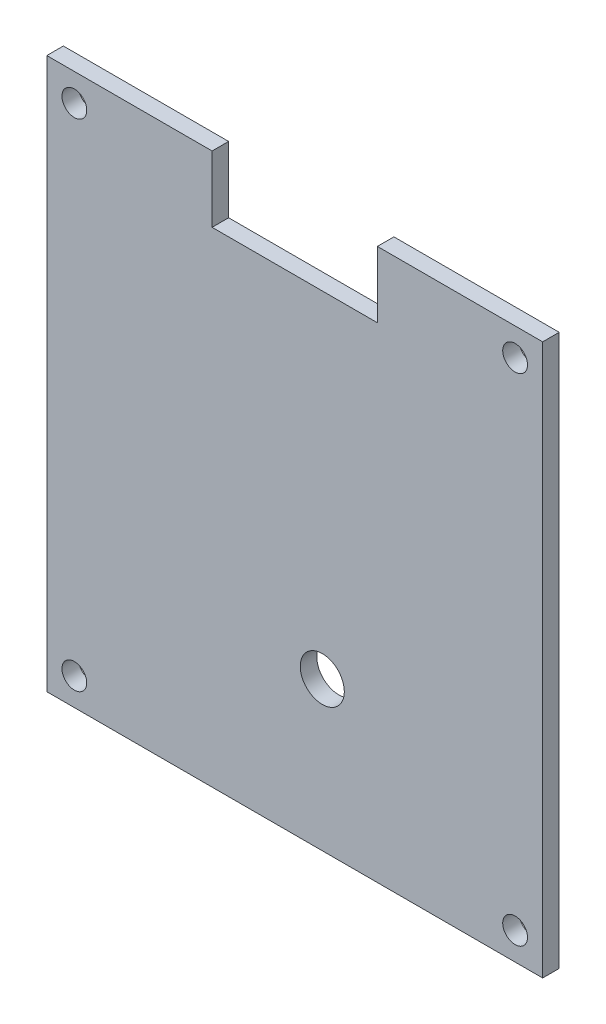
ISO-10303-21;
HEADER;
FILE_DESCRIPTION(('STEP AP214'),'2;1');
FILE_NAME('part.step','',(''),(''),'','','');
FILE_SCHEMA(('AUTOMOTIVE_DESIGN { 1 0 10303 214 1 1 1 1 }'));
ENDSEC;
DATA;
#1=APPLICATION_CONTEXT('core data for automotive mechanical design processes');
#2=APPLICATION_PROTOCOL_DEFINITION('international standard','automotive_design',2000,#1);
#3=PRODUCT_CONTEXT('',#1,'mechanical');
#4=PRODUCT('Part','Part','',(#3));
#5=PRODUCT_RELATED_PRODUCT_CATEGORY('part','',(#4));
#6=PRODUCT_DEFINITION_FORMATION('','',#4);
#7=PRODUCT_DEFINITION_CONTEXT('part definition',#1,'design');
#8=PRODUCT_DEFINITION('design','',#6,#7);
#9=PRODUCT_DEFINITION_SHAPE('','',#8);
#10=(LENGTH_UNIT() NAMED_UNIT(*) SI_UNIT(.MILLI.,.METRE.));
#11=(NAMED_UNIT(*) PLANE_ANGLE_UNIT() SI_UNIT($,.RADIAN.));
#12=(NAMED_UNIT(*) SI_UNIT($,.STERADIAN.) SOLID_ANGLE_UNIT());
#13=UNCERTAINTY_MEASURE_WITH_UNIT(LENGTH_MEASURE(1.E-05),#10,'distance_accuracy_value','');
#14=(GEOMETRIC_REPRESENTATION_CONTEXT(3) GLOBAL_UNCERTAINTY_ASSIGNED_CONTEXT((#13)) GLOBAL_UNIT_ASSIGNED_CONTEXT((#10,
#11,#12)) REPRESENTATION_CONTEXT('',''));
#15=CARTESIAN_POINT('',(0.,0.,0.));
#16=DIRECTION('',(0.,0.,1.));
#17=DIRECTION('',(1.,0.,0.));
#18=AXIS2_PLACEMENT_3D('',#15,#16,#17);
#19=CARTESIAN_POINT('',(-45.,50.,3.));
#20=DIRECTION('',(0.,1.,0.));
#21=DIRECTION('',(0.,0.,1.));
#22=AXIS2_PLACEMENT_3D('',#19,#20,#21);
#23=PLANE('',#22);
#24=DIRECTION('',(1.,0.,0.));
#25=VECTOR('',#24,1.);
#26=CARTESIAN_POINT('',(-45.,50.,0.));
#27=LINE('',#26,#25);
#28=CARTESIAN_POINT('',(-45.,50.,0.));
#29=VERTEX_POINT('',#28);
#30=CARTESIAN_POINT('',(-15.,50.,0.));
#31=VERTEX_POINT('',#30);
#32=EDGE_CURVE('E130',#29,#31,#27,.T.);
#33=ORIENTED_EDGE('',*,*,#32,.F.);
#34=DIRECTION('',(0.,0.,-1.));
#35=VECTOR('',#34,1.);
#36=CARTESIAN_POINT('',(-45.,50.,3.));
#37=LINE('',#36,#35);
#38=CARTESIAN_POINT('',(-45.,50.,3.));
#39=VERTEX_POINT('',#38);
#40=EDGE_CURVE('E11',#39,#29,#37,.T.);
#41=ORIENTED_EDGE('',*,*,#40,.F.);
#42=DIRECTION('',(1.,0.,0.));
#43=VECTOR('',#42,1.);
#44=CARTESIAN_POINT('',(-45.,50.,3.));
#45=LINE('',#44,#43);
#46=CARTESIAN_POINT('',(-15.,50.,3.));
#47=VERTEX_POINT('',#46);
#48=EDGE_CURVE('E151',#39,#47,#45,.T.);
#49=ORIENTED_EDGE('',*,*,#48,.T.);
#50=DIRECTION('',(0.,0.,-1.));
#51=VECTOR('',#50,1.);
#52=CARTESIAN_POINT('',(-15.,50.,3.));
#53=LINE('',#52,#51);
#54=EDGE_CURVE('E36',#47,#31,#53,.T.);
#55=ORIENTED_EDGE('',*,*,#54,.T.);
#56=EDGE_LOOP('',(#33,#41,#49,#55));
#57=FACE_BOUND('',#56,.T.);
#58=ADVANCED_FACE('F33',(#57),#23,.T.);
#59=CARTESIAN_POINT('',(-45.,-50.,3.));
#60=DIRECTION('',(-1.,0.,0.));
#61=DIRECTION('',(0.,0.,1.));
#62=AXIS2_PLACEMENT_3D('',#59,#60,#61);
#63=PLANE('',#62);
#64=DIRECTION('',(0.,1.,0.));
#65=VECTOR('',#64,1.);
#66=CARTESIAN_POINT('',(-45.,-50.,0.));
#67=LINE('',#66,#65);
#68=CARTESIAN_POINT('',(-45.,-50.,0.));
#69=VERTEX_POINT('',#68);
#70=EDGE_CURVE('E149',#69,#29,#67,.T.);
#71=ORIENTED_EDGE('',*,*,#70,.F.);
#72=DIRECTION('',(0.,0.,-1.));
#73=VECTOR('',#72,1.);
#74=CARTESIAN_POINT('',(-45.,-50.,3.));
#75=LINE('',#74,#73);
#76=CARTESIAN_POINT('',(-45.,-50.,3.));
#77=VERTEX_POINT('',#76);
#78=EDGE_CURVE('E42',#77,#69,#75,.T.);
#79=ORIENTED_EDGE('',*,*,#78,.F.);
#80=DIRECTION('',(0.,1.,0.));
#81=VECTOR('',#80,1.);
#82=CARTESIAN_POINT('',(-45.,-50.,3.));
#83=LINE('',#82,#81);
#84=EDGE_CURVE('E120',#77,#39,#83,.T.);
#85=ORIENTED_EDGE('',*,*,#84,.T.);
#86=ORIENTED_EDGE('',*,*,#40,.T.);
#87=EDGE_LOOP('',(#71,#79,#85,#86));
#88=FACE_BOUND('',#87,.T.);
#89=ADVANCED_FACE('F163',(#88),#63,.T.);
#90=CARTESIAN_POINT('',(45.,-50.,3.));
#91=DIRECTION('',(0.,-1.,0.));
#92=DIRECTION('',(0.,0.,-1.));
#93=AXIS2_PLACEMENT_3D('',#90,#91,#92);
#94=PLANE('',#93);
#95=DIRECTION('',(-1.,0.,0.));
#96=VECTOR('',#95,1.);
#97=CARTESIAN_POINT('',(45.,-50.,0.));
#98=LINE('',#97,#96);
#99=CARTESIAN_POINT('',(45.,-50.,0.));
#100=VERTEX_POINT('',#99);
#101=EDGE_CURVE('E107',#100,#69,#98,.T.);
#102=ORIENTED_EDGE('',*,*,#101,.F.);
#103=DIRECTION('',(0.,0.,-1.));
#104=VECTOR('',#103,1.);
#105=CARTESIAN_POINT('',(45.,-50.,3.));
#106=LINE('',#105,#104);
#107=CARTESIAN_POINT('',(45.,-50.,3.));
#108=VERTEX_POINT('',#107);
#109=EDGE_CURVE('E102',#108,#100,#106,.T.);
#110=ORIENTED_EDGE('',*,*,#109,.F.);
#111=DIRECTION('',(-1.,0.,0.));
#112=VECTOR('',#111,1.);
#113=CARTESIAN_POINT('',(45.,-50.,3.));
#114=LINE('',#113,#112);
#115=EDGE_CURVE('E105',#108,#77,#114,.T.);
#116=ORIENTED_EDGE('',*,*,#115,.T.);
#117=ORIENTED_EDGE('',*,*,#78,.T.);
#118=EDGE_LOOP('',(#102,#110,#116,#117));
#119=FACE_BOUND('',#118,.T.);
#120=ADVANCED_FACE('F104',(#119),#94,.T.);
#121=CARTESIAN_POINT('',(45.,50.,3.));
#122=DIRECTION('',(1.,0.,0.));
#123=DIRECTION('',(0.,0.,-1.));
#124=AXIS2_PLACEMENT_3D('',#121,#122,#123);
#125=PLANE('',#124);
#126=DIRECTION('',(0.,-1.,0.));
#127=VECTOR('',#126,1.);
#128=CARTESIAN_POINT('',(45.,50.,0.));
#129=LINE('',#128,#127);
#130=CARTESIAN_POINT('',(45.,50.,0.));
#131=VERTEX_POINT('',#130);
#132=EDGE_CURVE('E146',#131,#100,#129,.T.);
#133=ORIENTED_EDGE('',*,*,#132,.F.);
#134=DIRECTION('',(0.,0.,-1.));
#135=VECTOR('',#134,1.);
#136=CARTESIAN_POINT('',(45.,50.,3.));
#137=LINE('',#136,#135);
#138=CARTESIAN_POINT('',(45.,50.,3.));
#139=VERTEX_POINT('',#138);
#140=EDGE_CURVE('E112',#139,#131,#137,.T.);
#141=ORIENTED_EDGE('',*,*,#140,.F.);
#142=DIRECTION('',(0.,-1.,0.));
#143=VECTOR('',#142,1.);
#144=CARTESIAN_POINT('',(45.,50.,3.));
#145=LINE('',#144,#143);
#146=EDGE_CURVE('E118',#139,#108,#145,.T.);
#147=ORIENTED_EDGE('',*,*,#146,.T.);
#148=ORIENTED_EDGE('',*,*,#109,.T.);
#149=EDGE_LOOP('',(#133,#141,#147,#148));
#150=FACE_BOUND('',#149,.T.);
#151=ADVANCED_FACE('F122',(#150),#125,.T.);
#152=CARTESIAN_POINT('',(15.,50.,3.));
#153=DIRECTION('',(0.,1.,0.));
#154=DIRECTION('',(0.,0.,1.));
#155=AXIS2_PLACEMENT_3D('',#152,#153,#154);
#156=PLANE('',#155);
#157=DIRECTION('',(1.,0.,0.));
#158=VECTOR('',#157,1.);
#159=CARTESIAN_POINT('',(15.,50.,0.));
#160=LINE('',#159,#158);
#161=CARTESIAN_POINT('',(15.,50.,0.));
#162=VERTEX_POINT('',#161);
#163=EDGE_CURVE('E143',#162,#131,#160,.T.);
#164=ORIENTED_EDGE('',*,*,#163,.F.);
#165=DIRECTION('',(0.,0.,-1.));
#166=VECTOR('',#165,1.);
#167=CARTESIAN_POINT('',(15.,50.,3.));
#168=LINE('',#167,#166);
#169=CARTESIAN_POINT('',(15.,50.,3.));
#170=VERTEX_POINT('',#169);
#171=EDGE_CURVE('E155',#170,#162,#168,.T.);
#172=ORIENTED_EDGE('',*,*,#171,.F.);
#173=DIRECTION('',(1.,0.,0.));
#174=VECTOR('',#173,1.);
#175=CARTESIAN_POINT('',(15.,50.,3.));
#176=LINE('',#175,#174);
#177=EDGE_CURVE('E123',#170,#139,#176,.T.);
#178=ORIENTED_EDGE('',*,*,#177,.T.);
#179=ORIENTED_EDGE('',*,*,#140,.T.);
#180=EDGE_LOOP('',(#164,#172,#178,#179));
#181=FACE_BOUND('',#180,.T.);
#182=ADVANCED_FACE('F176',(#181),#156,.T.);
#183=CARTESIAN_POINT('',(15.,38.,3.));
#184=DIRECTION('',(-1.,0.,0.));
#185=DIRECTION('',(0.,-1.,0.));
#186=AXIS2_PLACEMENT_3D('',#183,#184,#185);
#187=PLANE('',#186);
#188=DIRECTION('',(0.,1.,0.));
#189=VECTOR('',#188,1.);
#190=CARTESIAN_POINT('',(15.,38.,0.));
#191=LINE('',#190,#189);
#192=CARTESIAN_POINT('',(15.,38.,0.));
#193=VERTEX_POINT('',#192);
#194=EDGE_CURVE('E140',#193,#162,#191,.T.);
#195=ORIENTED_EDGE('',*,*,#194,.F.);
#196=DIRECTION('',(0.,0.,-1.));
#197=VECTOR('',#196,1.);
#198=CARTESIAN_POINT('',(15.,38.,3.));
#199=LINE('',#198,#197);
#200=CARTESIAN_POINT('',(15.,38.,3.));
#201=VERTEX_POINT('',#200);
#202=EDGE_CURVE('E157',#201,#193,#199,.T.);
#203=ORIENTED_EDGE('',*,*,#202,.F.);
#204=DIRECTION('',(0.,1.,0.));
#205=VECTOR('',#204,1.);
#206=CARTESIAN_POINT('',(15.,38.,3.));
#207=LINE('',#206,#205);
#208=EDGE_CURVE('E125',#201,#170,#207,.T.);
#209=ORIENTED_EDGE('',*,*,#208,.T.);
#210=ORIENTED_EDGE('',*,*,#171,.T.);
#211=EDGE_LOOP('',(#195,#203,#209,#210));
#212=FACE_BOUND('',#211,.T.);
#213=ADVANCED_FACE('F179',(#212),#187,.T.);
#214=CARTESIAN_POINT('',(-15.,38.,3.));
#215=DIRECTION('',(0.,1.,0.));
#216=DIRECTION('',(0.,0.,1.));
#217=AXIS2_PLACEMENT_3D('',#214,#215,#216);
#218=PLANE('',#217);
#219=DIRECTION('',(1.,0.,0.));
#220=VECTOR('',#219,1.);
#221=CARTESIAN_POINT('',(-15.,38.,0.));
#222=LINE('',#221,#220);
#223=CARTESIAN_POINT('',(-15.,38.,0.));
#224=VERTEX_POINT('',#223);
#225=EDGE_CURVE('E137',#224,#193,#222,.T.);
#226=ORIENTED_EDGE('',*,*,#225,.F.);
#227=DIRECTION('',(0.,0.,-1.));
#228=VECTOR('',#227,1.);
#229=CARTESIAN_POINT('',(-15.,38.,3.));
#230=LINE('',#229,#228);
#231=CARTESIAN_POINT('',(-15.,38.,3.));
#232=VERTEX_POINT('',#231);
#233=EDGE_CURVE('E158',#232,#224,#230,.T.);
#234=ORIENTED_EDGE('',*,*,#233,.F.);
#235=DIRECTION('',(1.,0.,0.));
#236=VECTOR('',#235,1.);
#237=CARTESIAN_POINT('',(-15.,38.,3.));
#238=LINE('',#237,#236);
#239=EDGE_CURVE('E255',#232,#201,#238,.T.);
#240=ORIENTED_EDGE('',*,*,#239,.T.);
#241=ORIENTED_EDGE('',*,*,#202,.T.);
#242=EDGE_LOOP('',(#226,#234,#240,#241));
#243=FACE_BOUND('',#242,.T.);
#244=ADVANCED_FACE('F183',(#243),#218,.T.);
#245=CARTESIAN_POINT('',(-15.,50.,3.));
#246=DIRECTION('',(1.,0.,0.));
#247=DIRECTION('',(0.,1.,0.));
#248=AXIS2_PLACEMENT_3D('',#245,#246,#247);
#249=PLANE('',#248);
#250=DIRECTION('',(0.,-1.,0.));
#251=VECTOR('',#250,1.);
#252=CARTESIAN_POINT('',(-15.,50.,0.));
#253=LINE('',#252,#251);
#254=EDGE_CURVE('E133',#31,#224,#253,.T.);
#255=ORIENTED_EDGE('',*,*,#254,.F.);
#256=ORIENTED_EDGE('',*,*,#54,.F.);
#257=DIRECTION('',(0.,-1.,0.));
#258=VECTOR('',#257,1.);
#259=CARTESIAN_POINT('',(-15.,50.,3.));
#260=LINE('',#259,#258);
#261=EDGE_CURVE('E253',#47,#232,#260,.T.);
#262=ORIENTED_EDGE('',*,*,#261,.T.);
#263=ORIENTED_EDGE('',*,*,#233,.T.);
#264=EDGE_LOOP('',(#255,#256,#262,#263));
#265=FACE_BOUND('',#264,.T.);
#266=ADVANCED_FACE('F160',(#265),#249,.T.);
#267=CARTESIAN_POINT('',(0.,0.,3.));
#268=DIRECTION('',(0.,0.,-1.));
#269=DIRECTION('',(-1.,0.,0.));
#270=AXIS2_PLACEMENT_3D('',#267,#268,#269);
#271=PLANE('',#270);
#272=CARTESIAN_POINT('',(-40.,-45.,3.));
#273=DIRECTION('',(0.,0.,-1.));
#274=DIRECTION('',(1.,0.,0.));
#275=AXIS2_PLACEMENT_3D('',#272,#273,#274);
#276=CIRCLE('',#275,2.25);
#277=CARTESIAN_POINT('',(-37.75,-45.,3.));
#278=VERTEX_POINT('',#277);
#279=EDGE_CURVE('E222',#278,#278,#276,.T.);
#280=ORIENTED_EDGE('',*,*,#279,.T.);
#281=EDGE_LOOP('',(#280));
#282=FACE_BOUND('',#281,.T.);
#283=CARTESIAN_POINT('',(40.,-45.,3.));
#284=DIRECTION('',(0.,0.,-1.));
#285=DIRECTION('',(1.,0.,0.));
#286=AXIS2_PLACEMENT_3D('',#283,#284,#285);
#287=CIRCLE('',#286,2.25);
#288=CARTESIAN_POINT('',(42.25,-45.,3.));
#289=VERTEX_POINT('',#288);
#290=EDGE_CURVE('E230',#289,#289,#287,.T.);
#291=ORIENTED_EDGE('',*,*,#290,.T.);
#292=EDGE_LOOP('',(#291));
#293=FACE_BOUND('',#292,.T.);
#294=CARTESIAN_POINT('',(40.,45.,3.));
#295=DIRECTION('',(0.,0.,-1.));
#296=DIRECTION('',(1.,0.,0.));
#297=AXIS2_PLACEMENT_3D('',#294,#295,#296);
#298=CIRCLE('',#297,2.25);
#299=CARTESIAN_POINT('',(42.25,45.,3.));
#300=VERTEX_POINT('',#299);
#301=EDGE_CURVE('E236',#300,#300,#298,.T.);
#302=ORIENTED_EDGE('',*,*,#301,.T.);
#303=EDGE_LOOP('',(#302));
#304=FACE_BOUND('',#303,.T.);
#305=CARTESIAN_POINT('',(-40.,45.,3.));
#306=DIRECTION('',(0.,0.,-1.));
#307=DIRECTION('',(1.,0.,0.));
#308=AXIS2_PLACEMENT_3D('',#305,#306,#307);
#309=CIRCLE('',#308,2.25);
#310=CARTESIAN_POINT('',(-37.75,45.,3.));
#311=VERTEX_POINT('',#310);
#312=EDGE_CURVE('E242',#311,#311,#309,.T.);
#313=ORIENTED_EDGE('',*,*,#312,.T.);
#314=EDGE_LOOP('',(#313));
#315=FACE_BOUND('',#314,.T.);
#316=CARTESIAN_POINT('',(5.,-23.,3.));
#317=DIRECTION('',(0.,0.,-1.));
#318=DIRECTION('',(1.,0.,0.));
#319=AXIS2_PLACEMENT_3D('',#316,#317,#318);
#320=CIRCLE('',#319,4.);
#321=CARTESIAN_POINT('',(9.00000000000001,-23.,3.));
#322=VERTEX_POINT('',#321);
#323=EDGE_CURVE('E134',#322,#322,#320,.T.);
#324=ORIENTED_EDGE('',*,*,#323,.T.);
#325=EDGE_LOOP('',(#324));
#326=FACE_BOUND('',#325,.T.);
#327=ORIENTED_EDGE('',*,*,#48,.F.);
#328=ORIENTED_EDGE('',*,*,#84,.F.);
#329=ORIENTED_EDGE('',*,*,#115,.F.);
#330=ORIENTED_EDGE('',*,*,#146,.F.);
#331=ORIENTED_EDGE('',*,*,#177,.F.);
#332=ORIENTED_EDGE('',*,*,#208,.F.);
#333=ORIENTED_EDGE('',*,*,#239,.F.);
#334=ORIENTED_EDGE('',*,*,#261,.F.);
#335=EDGE_LOOP('',(#327,#328,#329,#330,#331,#332,#333,#334));
#336=FACE_BOUND('',#335,.T.);
#337=ADVANCED_FACE('F116',(#282,#293,#304,#315,#326,#336),#271,.F.);
#338=CARTESIAN_POINT('',(0.,0.,0.));
#339=DIRECTION('',(0.,0.,-1.));
#340=DIRECTION('',(-1.,0.,0.));
#341=AXIS2_PLACEMENT_3D('',#338,#339,#340);
#342=PLANE('',#341);
#343=CARTESIAN_POINT('',(-40.,-45.,0.));
#344=DIRECTION('',(0.,0.,-1.));
#345=DIRECTION('',(1.,0.,0.));
#346=AXIS2_PLACEMENT_3D('',#343,#344,#345);
#347=CIRCLE('',#346,2.25);
#348=CARTESIAN_POINT('',(-37.75,-45.,0.));
#349=VERTEX_POINT('',#348);
#350=EDGE_CURVE('E225',#349,#349,#347,.T.);
#351=ORIENTED_EDGE('',*,*,#350,.F.);
#352=EDGE_LOOP('',(#351));
#353=FACE_BOUND('',#352,.T.);
#354=CARTESIAN_POINT('',(40.,-45.,0.));
#355=DIRECTION('',(0.,0.,-1.));
#356=DIRECTION('',(1.,0.,0.));
#357=AXIS2_PLACEMENT_3D('',#354,#355,#356);
#358=CIRCLE('',#357,2.25);
#359=CARTESIAN_POINT('',(42.25,-45.,0.));
#360=VERTEX_POINT('',#359);
#361=EDGE_CURVE('E227',#360,#360,#358,.T.);
#362=ORIENTED_EDGE('',*,*,#361,.F.);
#363=EDGE_LOOP('',(#362));
#364=FACE_BOUND('',#363,.T.);
#365=CARTESIAN_POINT('',(40.,45.,0.));
#366=DIRECTION('',(0.,0.,-1.));
#367=DIRECTION('',(1.,0.,0.));
#368=AXIS2_PLACEMENT_3D('',#365,#366,#367);
#369=CIRCLE('',#368,2.25);
#370=CARTESIAN_POINT('',(42.25,45.,0.));
#371=VERTEX_POINT('',#370);
#372=EDGE_CURVE('E233',#371,#371,#369,.T.);
#373=ORIENTED_EDGE('',*,*,#372,.F.);
#374=EDGE_LOOP('',(#373));
#375=FACE_BOUND('',#374,.T.);
#376=CARTESIAN_POINT('',(-40.,45.,0.));
#377=DIRECTION('',(0.,0.,-1.));
#378=DIRECTION('',(1.,0.,0.));
#379=AXIS2_PLACEMENT_3D('',#376,#377,#378);
#380=CIRCLE('',#379,2.25);
#381=CARTESIAN_POINT('',(-37.75,45.,0.));
#382=VERTEX_POINT('',#381);
#383=EDGE_CURVE('E239',#382,#382,#380,.T.);
#384=ORIENTED_EDGE('',*,*,#383,.F.);
#385=EDGE_LOOP('',(#384));
#386=FACE_BOUND('',#385,.T.);
#387=CARTESIAN_POINT('',(5.,-23.,0.));
#388=DIRECTION('',(0.,0.,-1.));
#389=DIRECTION('',(1.,0.,0.));
#390=AXIS2_PLACEMENT_3D('',#387,#388,#389);
#391=CIRCLE('',#390,4.);
#392=CARTESIAN_POINT('',(9.00000000000001,-23.,0.));
#393=VERTEX_POINT('',#392);
#394=EDGE_CURVE('E245',#393,#393,#391,.T.);
#395=ORIENTED_EDGE('',*,*,#394,.F.);
#396=EDGE_LOOP('',(#395));
#397=FACE_BOUND('',#396,.T.);
#398=ORIENTED_EDGE('',*,*,#32,.T.);
#399=ORIENTED_EDGE('',*,*,#254,.T.);
#400=ORIENTED_EDGE('',*,*,#225,.T.);
#401=ORIENTED_EDGE('',*,*,#194,.T.);
#402=ORIENTED_EDGE('',*,*,#163,.T.);
#403=ORIENTED_EDGE('',*,*,#132,.T.);
#404=ORIENTED_EDGE('',*,*,#101,.T.);
#405=ORIENTED_EDGE('',*,*,#70,.T.);
#406=EDGE_LOOP('',(#398,#399,#400,#401,#402,#403,#404,#405));
#407=FACE_BOUND('',#406,.T.);
#408=ADVANCED_FACE('F162',(#353,#364,#375,#386,#397,#407),#342,.T.);
#409=CARTESIAN_POINT('',(5.,-23.,3.));
#410=DIRECTION('',(0.,0.,-1.));
#411=DIRECTION('',(-1.,0.,0.));
#412=AXIS2_PLACEMENT_3D('',#409,#410,#411);
#413=CYLINDRICAL_SURFACE('',#412,4.);
#414=ORIENTED_EDGE('',*,*,#323,.F.);
#415=EDGE_LOOP('',(#414));
#416=FACE_BOUND('',#415,.T.);
#417=ORIENTED_EDGE('',*,*,#394,.T.);
#418=EDGE_LOOP('',(#417));
#419=FACE_BOUND('',#418,.T.);
#420=ADVANCED_FACE('F195',(#416,#419),#413,.F.);
#421=CARTESIAN_POINT('',(-40.,45.,3.));
#422=DIRECTION('',(0.,0.,-1.));
#423=DIRECTION('',(-1.,0.,0.));
#424=AXIS2_PLACEMENT_3D('',#421,#422,#423);
#425=CYLINDRICAL_SURFACE('',#424,2.25);
#426=ORIENTED_EDGE('',*,*,#312,.F.);
#427=EDGE_LOOP('',(#426));
#428=FACE_BOUND('',#427,.T.);
#429=ORIENTED_EDGE('',*,*,#383,.T.);
#430=EDGE_LOOP('',(#429));
#431=FACE_BOUND('',#430,.T.);
#432=ADVANCED_FACE('F202',(#428,#431),#425,.F.);
#433=CARTESIAN_POINT('',(40.,45.,3.));
#434=DIRECTION('',(0.,0.,-1.));
#435=DIRECTION('',(-1.,0.,0.));
#436=AXIS2_PLACEMENT_3D('',#433,#434,#435);
#437=CYLINDRICAL_SURFACE('',#436,2.25);
#438=ORIENTED_EDGE('',*,*,#301,.F.);
#439=EDGE_LOOP('',(#438));
#440=FACE_BOUND('',#439,.T.);
#441=ORIENTED_EDGE('',*,*,#372,.T.);
#442=EDGE_LOOP('',(#441));
#443=FACE_BOUND('',#442,.T.);
#444=ADVANCED_FACE('F206',(#440,#443),#437,.F.);
#445=CARTESIAN_POINT('',(40.,-45.,3.));
#446=DIRECTION('',(0.,0.,-1.));
#447=DIRECTION('',(-1.,0.,0.));
#448=AXIS2_PLACEMENT_3D('',#445,#446,#447);
#449=CYLINDRICAL_SURFACE('',#448,2.25);
#450=ORIENTED_EDGE('',*,*,#290,.F.);
#451=EDGE_LOOP('',(#450));
#452=FACE_BOUND('',#451,.T.);
#453=ORIENTED_EDGE('',*,*,#361,.T.);
#454=EDGE_LOOP('',(#453));
#455=FACE_BOUND('',#454,.T.);
#456=ADVANCED_FACE('F210',(#452,#455),#449,.F.);
#457=CARTESIAN_POINT('',(-40.,-45.,3.));
#458=DIRECTION('',(0.,0.,-1.));
#459=DIRECTION('',(-1.,0.,0.));
#460=AXIS2_PLACEMENT_3D('',#457,#458,#459);
#461=CYLINDRICAL_SURFACE('',#460,2.25);
#462=ORIENTED_EDGE('',*,*,#279,.F.);
#463=EDGE_LOOP('',(#462));
#464=FACE_BOUND('',#463,.T.);
#465=ORIENTED_EDGE('',*,*,#350,.T.);
#466=EDGE_LOOP('',(#465));
#467=FACE_BOUND('',#466,.T.);
#468=ADVANCED_FACE('F214',(#464,#467),#461,.F.);
#469=CLOSED_SHELL('',(#58,#89,#120,#151,#182,#213,#244,#266,#337,#408,#420,#432,#444,#456,#468));
#470=MANIFOLD_SOLID_BREP('B2',#469);
#471=ADVANCED_BREP_SHAPE_REPRESENTATION('',(#18,#470),#14);
#472=SHAPE_DEFINITION_REPRESENTATION(#9,#471);
ENDSEC;
END-ISO-10303-21;
